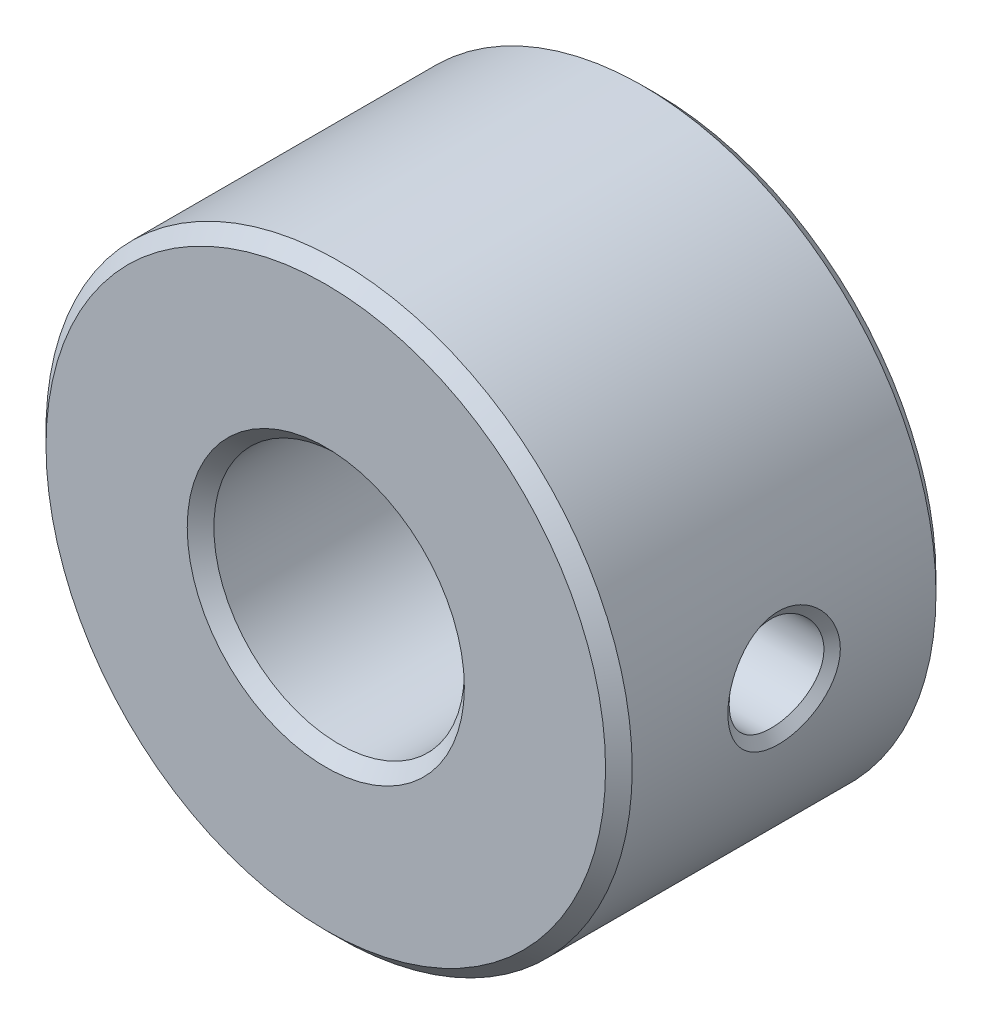
ISO-10303-21;
HEADER;
FILE_DESCRIPTION(('STEP AP214'),'2;1');
FILE_NAME('part.step','',(''),(''),'','','');
FILE_SCHEMA(('AUTOMOTIVE_DESIGN { 1 0 10303 214 1 1 1 1 }'));
ENDSEC;
DATA;
#1=APPLICATION_CONTEXT('core data for automotive mechanical design processes');
#2=APPLICATION_PROTOCOL_DEFINITION('international standard','automotive_design',2000,#1);
#3=PRODUCT_CONTEXT('',#1,'mechanical');
#4=PRODUCT('Part','Part','',(#3));
#5=PRODUCT_RELATED_PRODUCT_CATEGORY('part','',(#4));
#6=PRODUCT_DEFINITION_FORMATION('','',#4);
#7=PRODUCT_DEFINITION_CONTEXT('part definition',#1,'design');
#8=PRODUCT_DEFINITION('design','',#6,#7);
#9=PRODUCT_DEFINITION_SHAPE('','',#8);
#10=(LENGTH_UNIT() NAMED_UNIT(*) SI_UNIT(.MILLI.,.METRE.));
#11=(NAMED_UNIT(*) PLANE_ANGLE_UNIT() SI_UNIT($,.RADIAN.));
#12=(NAMED_UNIT(*) SI_UNIT($,.STERADIAN.) SOLID_ANGLE_UNIT());
#13=UNCERTAINTY_MEASURE_WITH_UNIT(LENGTH_MEASURE(1.E-05),#10,'distance_accuracy_value','');
#14=(GEOMETRIC_REPRESENTATION_CONTEXT(3) GLOBAL_UNCERTAINTY_ASSIGNED_CONTEXT((#13)) GLOBAL_UNIT_ASSIGNED_CONTEXT((#10,
#11,#12)) REPRESENTATION_CONTEXT('',''));
#15=CARTESIAN_POINT('',(0.,0.,0.));
#16=DIRECTION('',(0.,0.,1.));
#17=DIRECTION('',(1.,0.,0.));
#18=AXIS2_PLACEMENT_3D('',#15,#16,#17);
#19=CARTESIAN_POINT('',(0.,0.,-3.1));
#20=DIRECTION('',(0.,0.,1.));
#21=DIRECTION('',(1.,0.,0.));
#22=AXIS2_PLACEMENT_3D('',#19,#20,#21);
#23=CYLINDRICAL_SURFACE('',#22,5.5);
#24=CARTESIAN_POINT('',(5.5,0.,-1.0544551740816));
#25=CARTESIAN_POINT('',(5.500004744347,0.580026043715092,-1.05444676988451));
#26=CARTESIAN_POINT('',(5.39249519245081,1.08234138552855,-0.565479996225667));
#27=CARTESIAN_POINT('',(5.39241001331549,1.08233404109659,0.564563113119124));
#28=CARTESIAN_POINT('',(5.49999234411375,0.581308739379196,1.05443221743905));
#29=CARTESIAN_POINT('',(5.50000765588236,-0.581299487756133,1.05447813070488));
#30=CARTESIAN_POINT('',(5.39241958015795,-1.08225576805672,0.564363377852685));
#31=CARTESIAN_POINT('',(5.39248566019764,-1.08241948623678,-0.565607891176715));
#32=CARTESIAN_POINT('',(5.499995255653,-0.580026043715091,-1.05446357827869));
#33=CARTESIAN_POINT('',(5.5,0.,-1.0544551740816));
#34=B_SPLINE_CURVE_WITH_KNOTS('',3,(#24,#25,#26,#27,#28,#29,#30,#31,#32,#33),.UNSPECIFIED.,.T.,
.F.,(4,2,2,2,4),(-0.0066043131657145,-0.00495192706341636,-0.00329954096111823,
-0.00164715485882009,5.23124347804119E-06),.UNSPECIFIED.);
#35=CARTESIAN_POINT('',(5.5,0.,-1.0544551740816));
#36=VERTEX_POINT('',#35);
#37=EDGE_CURVE('E10',#36,#36,#34,.F.);
#38=ORIENTED_EDGE('',*,*,#37,.T.);
#39=EDGE_LOOP('',(#38));
#40=FACE_BOUND('',#39,.T.);
#41=CARTESIAN_POINT('',(0.,0.,2.84999999999999));
#42=DIRECTION('',(0.,0.,1.));
#43=DIRECTION('',(1.,0.,0.));
#44=AXIS2_PLACEMENT_3D('',#41,#42,#43);
#45=CIRCLE('',#44,5.5);
#46=CARTESIAN_POINT('',(5.5,0.,2.84999999999999));
#47=VERTEX_POINT('',#46);
#48=EDGE_CURVE('E98',#47,#47,#45,.F.);
#49=ORIENTED_EDGE('',*,*,#48,.T.);
#50=EDGE_LOOP('',(#49));
#51=FACE_BOUND('',#50,.T.);
#52=CARTESIAN_POINT('',(0.,0.,-2.85000000000001));
#53=DIRECTION('',(0.,0.,1.));
#54=DIRECTION('',(1.,0.,0.));
#55=AXIS2_PLACEMENT_3D('',#52,#53,#54);
#56=CIRCLE('',#55,5.5);
#57=CARTESIAN_POINT('',(5.5,0.,-2.85000000000001));
#58=VERTEX_POINT('',#57);
#59=EDGE_CURVE('E95',#58,#58,#56,.T.);
#60=ORIENTED_EDGE('',*,*,#59,.T.);
#61=EDGE_LOOP('',(#60));
#62=FACE_BOUND('',#61,.T.);
#63=ADVANCED_FACE('F34',(#40,#51,#62),#23,.T.);
#64=CARTESIAN_POINT('',(0.,0.,-3.1));
#65=DIRECTION('',(0.,0.,1.));
#66=DIRECTION('',(1.,0.,0.));
#67=AXIS2_PLACEMENT_3D('',#64,#65,#66);
#68=PLANE('',#67);
#69=CARTESIAN_POINT('',(0.,0.,-3.1));
#70=DIRECTION('',(0.,0.,1.));
#71=DIRECTION('',(1.,0.,0.));
#72=AXIS2_PLACEMENT_3D('',#69,#70,#71);
#73=CIRCLE('',#72,5.25000000000001);
#74=CARTESIAN_POINT('',(5.25000000000001,0.,-3.1));
#75=VERTEX_POINT('',#74);
#76=EDGE_CURVE('E51',#75,#75,#73,.F.);
#77=ORIENTED_EDGE('',*,*,#76,.T.);
#78=EDGE_LOOP('',(#77));
#79=FACE_BOUND('',#78,.T.);
#80=CARTESIAN_POINT('',(0.,0.,-3.1));
#81=DIRECTION('',(0.,0.,1.));
#82=DIRECTION('',(1.,0.,0.));
#83=AXIS2_PLACEMENT_3D('',#80,#81,#82);
#84=CIRCLE('',#83,2.6);
#85=CARTESIAN_POINT('',(2.6,0.,-3.1));
#86=VERTEX_POINT('',#85);
#87=EDGE_CURVE('E56',#86,#86,#84,.T.);
#88=ORIENTED_EDGE('',*,*,#87,.T.);
#89=EDGE_LOOP('',(#88));
#90=FACE_BOUND('',#89,.T.);
#91=ADVANCED_FACE('F124',(#79,#90),#68,.F.);
#92=CARTESIAN_POINT('',(0.,0.,3.1));
#93=DIRECTION('',(0.,0.,1.));
#94=DIRECTION('',(1.,0.,0.));
#95=AXIS2_PLACEMENT_3D('',#92,#93,#94);
#96=PLANE('',#95);
#97=CARTESIAN_POINT('',(0.,0.,3.1));
#98=DIRECTION('',(0.,0.,1.));
#99=DIRECTION('',(1.,0.,0.));
#100=AXIS2_PLACEMENT_3D('',#97,#98,#99);
#101=CIRCLE('',#100,5.24999999999999);
#102=CARTESIAN_POINT('',(5.24999999999999,0.,3.1));
#103=VERTEX_POINT('',#102);
#104=EDGE_CURVE('E92',#103,#103,#101,.T.);
#105=ORIENTED_EDGE('',*,*,#104,.T.);
#106=EDGE_LOOP('',(#105));
#107=FACE_BOUND('',#106,.T.);
#108=CARTESIAN_POINT('',(0.,0.,3.1));
#109=DIRECTION('',(0.,0.,1.));
#110=DIRECTION('',(1.,0.,0.));
#111=AXIS2_PLACEMENT_3D('',#108,#109,#110);
#112=CIRCLE('',#111,2.59999999999999);
#113=CARTESIAN_POINT('',(2.59999999999999,0.,3.1));
#114=VERTEX_POINT('',#113);
#115=EDGE_CURVE('E89',#114,#114,#112,.F.);
#116=ORIENTED_EDGE('',*,*,#115,.T.);
#117=EDGE_LOOP('',(#116));
#118=FACE_BOUND('',#117,.T.);
#119=ADVANCED_FACE('F129',(#107,#118),#96,.T.);
#120=CARTESIAN_POINT('',(0.,0.,-3.1));
#121=DIRECTION('',(0.,0.,1.));
#122=DIRECTION('',(1.,0.,0.));
#123=AXIS2_PLACEMENT_3D('',#120,#121,#122);
#124=CYLINDRICAL_SURFACE('',#123,2.35);
#125=CARTESIAN_POINT('',(2.35,0.,-0.888999999999999));
#126=CARTESIAN_POINT('',(2.35000140707631,0.048115186925079,-0.889001866284343));
#127=CARTESIAN_POINT('',(2.34850950605383,0.0962177098448817,-0.885081647398307));
#128=CARTESIAN_POINT('',(2.34270733382693,0.190983546485089,-0.869569155087926));
#129=CARTESIAN_POINT('',(2.33839752310871,0.237647094049921,-0.857978135176902));
#130=CARTESIAN_POINT('',(2.32742165295812,0.328154472471897,-0.827593752956557));
#131=CARTESIAN_POINT('',(2.32076018973228,0.372003607811834,-0.808814433885862));
#132=CARTESIAN_POINT('',(2.30574318032279,0.45592547640493,-0.764658613959366));
#133=CARTESIAN_POINT('',(2.29738717154624,0.495997174072754,-0.739280311116151));
#134=CARTESIAN_POINT('',(2.2794398248948,0.572954183020897,-0.681504813032714));
#135=CARTESIAN_POINT('',(2.26981310169239,0.609655171499627,-0.648873197353185));
#136=CARTESIAN_POINT('',(2.25058186695365,0.677212859462352,-0.578015009261017));
#137=CARTESIAN_POINT('',(2.24097736332329,0.70806772388726,-0.539786686732563));
#138=CARTESIAN_POINT('',(2.22246434388203,0.764239837865894,-0.457007170612021));
#139=CARTESIAN_POINT('',(2.21359744468071,0.7892949345214,-0.412267843813389));
#140=CARTESIAN_POINT('',(2.19811523889301,0.831442921290767,-0.318822304459222));
#141=CARTESIAN_POINT('',(2.19149901517726,0.84853905565705,-0.270117717761382));
#142=CARTESIAN_POINT('',(2.18164612219023,0.873553208967144,-0.172247378355854));
#143=CARTESIAN_POINT('',(2.17828031741972,0.881823440129958,-0.123185089673674));
#144=CARTESIAN_POINT('',(2.17493192069827,0.890052178585222,-0.0242625068748073));
#145=CARTESIAN_POINT('',(2.174947899632,0.890014196863178,0.0255974412499916));
#146=CARTESIAN_POINT('',(2.17825007686314,0.881896592517579,0.12145716040321));
#147=CARTESIAN_POINT('',(2.18133648206428,0.874308266703005,0.167506703079702));
#148=CARTESIAN_POINT('',(2.19009929043634,0.852118474357127,0.257622345570875));
#149=CARTESIAN_POINT('',(2.19577609071786,0.837515932520196,0.301688140136281));
#150=CARTESIAN_POINT('',(2.20919860485616,0.801446537300097,0.387577292023376));
#151=CARTESIAN_POINT('',(2.21698181336035,0.779853734667864,0.42934163850231));
#152=CARTESIAN_POINT('',(2.23372797429106,0.730504628502734,0.508795673366254));
#153=CARTESIAN_POINT('',(2.2426913386182,0.702746170684489,0.546483930701603));
#154=CARTESIAN_POINT('',(2.26153660542259,0.639615589040909,0.61943159596374));
#155=CARTESIAN_POINT('',(2.27143937223554,0.603852213440843,0.654347854151304));
#156=CARTESIAN_POINT('',(2.29052063956349,0.526864749477631,0.717790313031165));
#157=CARTESIAN_POINT('',(2.29969902464782,0.485639793600652,0.746315496628208));
#158=CARTESIAN_POINT('',(2.31648562497801,0.398011544653526,0.796553553775788));
#159=CARTESIAN_POINT('',(2.32406639558356,0.351536009233306,0.818150242908417));
#160=CARTESIAN_POINT('',(2.33659954969463,0.25525304126368,0.853104091653567));
#161=CARTESIAN_POINT('',(2.34155312194585,0.205447127140078,0.866464978218503));
#162=CARTESIAN_POINT('',(2.34806379294274,0.106803720431817,0.88390385592193));
#163=CARTESIAN_POINT('',(2.34978972859306,0.0580589698750885,0.888443812242127));
#164=CARTESIAN_POINT('',(2.35017371174371,-0.0395208918615776,0.889459542903284));
#165=CARTESIAN_POINT('',(2.34883245377216,-0.0883559800836499,0.885937142865119));
#166=CARTESIAN_POINT('',(2.34334405086432,-0.182721432554753,0.871277856882935));
#167=CARTESIAN_POINT('',(2.3393090926069,-0.228306275652867,0.860445237049264));
#168=CARTESIAN_POINT('',(2.32895235850414,-0.316978076513538,0.831875351825645));
#169=CARTESIAN_POINT('',(2.32263028544657,-0.360064708787047,0.814137189032529));
#170=CARTESIAN_POINT('',(2.30808985048739,-0.443945642192283,0.771691699404412));
#171=CARTESIAN_POINT('',(2.2998209393578,-0.484634472416177,0.746793789235255));
#172=CARTESIAN_POINT('',(2.28229915052854,-0.561393961141101,0.690950456954975));
#173=CARTESIAN_POINT('',(2.27304590568957,-0.597462885364259,0.660002774753957));
#174=CARTESIAN_POINT('',(2.25389472210002,-0.666187718938294,0.590788536511787));
#175=CARTESIAN_POINT('',(2.24399098311874,-0.69851625618747,0.552197681603637));
#176=CARTESIAN_POINT('',(2.22518056285627,-0.756305276977009,0.469946293881352));
#177=CARTESIAN_POINT('',(2.21627397980038,-0.781765084257673,0.426285262488702));
#178=CARTESIAN_POINT('',(2.20049754418703,-0.825135455645648,0.334736878533443));
#179=CARTESIAN_POINT('',(2.1936376612401,-0.843009240506266,0.286830266935531));
#180=CARTESIAN_POINT('',(2.1829496519933,-0.87031603048621,0.188354455361436));
#181=CARTESIAN_POINT('',(2.17911960480811,-0.879754384077325,0.137786964082003));
#182=CARTESIAN_POINT('',(2.17518303078595,-0.889440006010089,0.0389791697308565));
#183=CARTESIAN_POINT('',(2.17484985703114,-0.890246793174503,-0.00919769622599497));
#184=CARTESIAN_POINT('',(2.17736205525583,-0.884084481019557,-0.104962408624742));
#185=CARTESIAN_POINT('',(2.18020711463272,-0.877116146440682,-0.15255031252995));
#186=CARTESIAN_POINT('',(2.18856506928263,-0.856039915463804,-0.244257231186627));
#187=CARTESIAN_POINT('',(2.19399078321103,-0.842164685389258,-0.288438349406605));
#188=CARTESIAN_POINT('',(2.2068465024456,-0.807875067228952,-0.373870351620757));
#189=CARTESIAN_POINT('',(2.21427701853517,-0.787459012423346,-0.415120485470494));
#190=CARTESIAN_POINT('',(2.23079571551651,-0.739410302866601,-0.49590092479153));
#191=CARTESIAN_POINT('',(2.23995095186575,-0.711452101394908,-0.53522370612719));
#192=CARTESIAN_POINT('',(2.25866014857737,-0.649612983879455,-0.60879807450977));
#193=CARTESIAN_POINT('',(2.26821423604695,-0.61573016862088,-0.643048028870975));
#194=CARTESIAN_POINT('',(2.28728117248565,-0.540758311258718,-0.707442747205063));
#195=CARTESIAN_POINT('',(2.29676234625137,-0.49937382413809,-0.73725447983383));
#196=CARTESIAN_POINT('',(2.31405900429282,-0.411848691517378,-0.78949288857394));
#197=CARTESIAN_POINT('',(2.32187430846855,-0.365707532564603,-0.811918766330602));
#198=CARTESIAN_POINT('',(2.33527961532088,-0.267477134521013,-0.84951666464526));
#199=CARTESIAN_POINT('',(2.34073649042164,-0.215204842707235,-0.864262588368513));
#200=CARTESIAN_POINT('',(2.34809495563215,-0.108615598578685,-0.884000642838147));
#201=CARTESIAN_POINT('',(2.34999841206332,-0.0542997348876734,-0.888997893830376));
#202=CARTESIAN_POINT('',(2.35,0.,-0.888999999999999));
#203=B_SPLINE_CURVE_WITH_KNOTS('',3,(#125,#126,#127,#128,#129,#130,#131,#132,#133,#134,#135,
#136,#137,#138,#139,#140,#141,#142,#143,#144,#145,#146,#147,#148,#149,#150,#151,#152,#153,#154,
#155,#156,#157,#158,#159,#160,#161,#162,#163,#164,#165,#166,#167,#168,#169,#170,#171,#172,#173,
#174,#175,#176,#177,#178,#179,#180,#181,#182,#183,#184,#185,#186,#187,#188,#189,#190,#191,#192,
#193,#194,#195,#196,#197,#198,#199,#200,#201,#202),.UNSPECIFIED.,.T.,.F.,(4,2,2,2,2,2,2,2,2,2,2,
2,2,2,2,2,2,2,2,2,2,2,2,2,2,2,2,2,2,2,2,2,2,2,2,2,2,2,4),(0.,0.144145243594158,
0.288266937707596,0.432108497409597,0.575989377314956,0.72546118440935,0.874979832252769,
1.03031569330107,1.18558818039032,1.33440156217599,1.48315205671698,1.62281739456641,
1.76250415047286,1.9048626459388,2.04727096005129,2.1994329461631,2.35161913062786,
2.5062380285989,2.66078690532585,2.80699705804123,2.95317410655136,3.09361424198755,
3.23407263428154,3.3786847403281,3.52335097455127,3.67656097071541,3.82978604564474,
3.983745741481,4.13760775002091,4.28143055458225,4.42523921435844,4.56450166370071,
4.70379962788388,4.85049184671042,4.99723117620423,5.15210887457551,5.30700330855655,
5.46976195594722,5.63243509540046),.UNSPECIFIED.);
#204=CARTESIAN_POINT('',(2.35,0.,-0.888999999999999));
#205=VERTEX_POINT('',#204);
#206=EDGE_CURVE('E84',#205,#205,#203,.T.);
#207=ORIENTED_EDGE('',*,*,#206,.T.);
#208=EDGE_LOOP('',(#207));
#209=FACE_BOUND('',#208,.T.);
#210=CARTESIAN_POINT('',(0.,0.,2.85000000000001));
#211=DIRECTION('',(0.,0.,1.));
#212=DIRECTION('',(1.,0.,0.));
#213=AXIS2_PLACEMENT_3D('',#210,#211,#212);
#214=CIRCLE('',#213,2.35);
#215=CARTESIAN_POINT('',(2.35,0.,2.85000000000001));
#216=VERTEX_POINT('',#215);
#217=EDGE_CURVE('E61',#216,#216,#214,.T.);
#218=ORIENTED_EDGE('',*,*,#217,.T.);
#219=EDGE_LOOP('',(#218));
#220=FACE_BOUND('',#219,.T.);
#221=CARTESIAN_POINT('',(0.,0.,-2.84999999999999));
#222=DIRECTION('',(0.,0.,1.));
#223=DIRECTION('',(1.,0.,0.));
#224=AXIS2_PLACEMENT_3D('',#221,#222,#223);
#225=CIRCLE('',#224,2.35);
#226=CARTESIAN_POINT('',(2.35,0.,-2.84999999999999));
#227=VERTEX_POINT('',#226);
#228=EDGE_CURVE('E101',#227,#227,#225,.F.);
#229=ORIENTED_EDGE('',*,*,#228,.T.);
#230=EDGE_LOOP('',(#229));
#231=FACE_BOUND('',#230,.T.);
#232=ADVANCED_FACE('F79',(#209,#220,#231),#124,.F.);
#233=CARTESIAN_POINT('',(0.,0.,3.1));
#234=DIRECTION('',(0.,0.,-1.));
#235=DIRECTION('',(-1.,0.,0.));
#236=AXIS2_PLACEMENT_3D('',#233,#234,#235);
#237=CONICAL_SURFACE('',#236,5.24999999999999,0.785398163397447);
#238=ORIENTED_EDGE('',*,*,#48,.F.);
#239=EDGE_LOOP('',(#238));
#240=FACE_BOUND('',#239,.T.);
#241=ORIENTED_EDGE('',*,*,#104,.F.);
#242=EDGE_LOOP('',(#241));
#243=FACE_BOUND('',#242,.T.);
#244=ADVANCED_FACE('F111',(#240,#243),#237,.T.);
#245=CARTESIAN_POINT('',(0.,0.,2.85000000000001));
#246=DIRECTION('',(0.,0.,1.));
#247=DIRECTION('',(1.,0.,0.));
#248=AXIS2_PLACEMENT_3D('',#245,#246,#247);
#249=CONICAL_SURFACE('',#248,2.35,0.785398163397448);
#250=ORIENTED_EDGE('',*,*,#115,.F.);
#251=EDGE_LOOP('',(#250));
#252=FACE_BOUND('',#251,.T.);
#253=ORIENTED_EDGE('',*,*,#217,.F.);
#254=EDGE_LOOP('',(#253));
#255=FACE_BOUND('',#254,.T.);
#256=ADVANCED_FACE('F108',(#252,#255),#249,.F.);
#257=CARTESIAN_POINT('',(0.,0.,-2.85000000000001));
#258=DIRECTION('',(0.,0.,1.));
#259=DIRECTION('',(1.,0.,0.));
#260=AXIS2_PLACEMENT_3D('',#257,#258,#259);
#261=CONICAL_SURFACE('',#260,5.5,0.785398163397445);
#262=ORIENTED_EDGE('',*,*,#76,.F.);
#263=EDGE_LOOP('',(#262));
#264=FACE_BOUND('',#263,.T.);
#265=ORIENTED_EDGE('',*,*,#59,.F.);
#266=EDGE_LOOP('',(#265));
#267=FACE_BOUND('',#266,.T.);
#268=ADVANCED_FACE('F110',(#264,#267),#261,.T.);
#269=CARTESIAN_POINT('',(0.,0.,-3.1));
#270=DIRECTION('',(0.,0.,-1.));
#271=DIRECTION('',(-1.,0.,0.));
#272=AXIS2_PLACEMENT_3D('',#269,#270,#271);
#273=CONICAL_SURFACE('',#272,2.6,0.785398163397446);
#274=ORIENTED_EDGE('',*,*,#228,.F.);
#275=EDGE_LOOP('',(#274));
#276=FACE_BOUND('',#275,.T.);
#277=ORIENTED_EDGE('',*,*,#87,.F.);
#278=EDGE_LOOP('',(#277));
#279=FACE_BOUND('',#278,.T.);
#280=ADVANCED_FACE('F78',(#276,#279),#273,.F.);
#281=CARTESIAN_POINT('',(5.5,0.,0.));
#282=DIRECTION('',(1.,0.,0.));
#283=DIRECTION('',(0.,0.,-1.));
#284=AXIS2_PLACEMENT_3D('',#281,#282,#283);
#285=CYLINDRICAL_SURFACE('',#284,0.888999999999998);
#286=CARTESIAN_POINT('',(5.35831177090091,0.,-0.888999999999998));
#287=CARTESIAN_POINT('',(5.35831190454961,-0.0148303368773454,-0.889001122594029));
#288=CARTESIAN_POINT('',(5.35821000208172,-0.0296602449487385,-0.888601095422739));
#289=CARTESIAN_POINT('',(5.35781313056451,-0.0591737232770636,-0.887011904584699));
#290=CARTESIAN_POINT('',(5.35751948290577,-0.0738576018014636,-0.885828141176691));
#291=CARTESIAN_POINT('',(5.35675195497271,-0.10305723083344,-0.882692976828264));
#292=CARTESIAN_POINT('',(5.35627906575487,-0.117573461493737,-0.880745794956692));
#293=CARTESIAN_POINT('',(5.3551662392455,-0.146416474950188,-0.876106467732402));
#294=CARTESIAN_POINT('',(5.35452701914742,-0.160743800196549,-0.873417517847655));
#295=CARTESIAN_POINT('',(5.35309454661383,-0.189187694444922,-0.867316800242118));
#296=CARTESIAN_POINT('',(5.3523017932197,-0.203304790848007,-0.863907371165085));
#297=CARTESIAN_POINT('',(5.35057524417366,-0.231307013386006,-0.856387766842206));
#298=CARTESIAN_POINT('',(5.34964177897248,-0.245192600517681,-0.852279230557509));
#299=CARTESIAN_POINT('',(5.34764674003821,-0.272710628364245,-0.843383299459958));
#300=CARTESIAN_POINT('',(5.34658537136636,-0.286343434896508,-0.83859698918654));
#301=CARTESIAN_POINT('',(5.34434741955788,-0.313334749295235,-0.828367259645517));
#302=CARTESIAN_POINT('',(5.34317095234548,-0.326693517087186,-0.822924500275505));
#303=CARTESIAN_POINT('',(5.34071566239075,-0.353115606160227,-0.811403492023596));
#304=CARTESIAN_POINT('',(5.33943689579563,-0.366179084529708,-0.805325591186736));
#305=CARTESIAN_POINT('',(5.33678983854157,-0.391989438944354,-0.792555809409549));
#306=CARTESIAN_POINT('',(5.33542156708004,-0.404736382077489,-0.78586406000713));
#307=CARTESIAN_POINT('',(5.33260831039065,-0.429892493126496,-0.771887997582564));
#308=CARTESIAN_POINT('',(5.33116332430376,-0.442301657257677,-0.764603677924525));
#309=CARTESIAN_POINT('',(5.32820943335275,-0.466761014847309,-0.749463815748874));
#310=CARTESIAN_POINT('',(5.32670051927188,-0.478811156114662,-0.741608190746328));
#311=CARTESIAN_POINT('',(5.32363155702158,-0.502531247288997,-0.725346998706824));
#312=CARTESIAN_POINT('',(5.32207149859278,-0.51420111996777,-0.716941320990351));
#313=CARTESIAN_POINT('',(5.31891302622216,-0.537139427728482,-0.699601258791105));
#314=CARTESIAN_POINT('',(5.31731460474357,-0.548407782830248,-0.690666769904733));
#315=CARTESIAN_POINT('',(5.31409218207409,-0.570521785227812,-0.672290287885338));
#316=CARTESIAN_POINT('',(5.3124681771114,-0.581367369359555,-0.662848219414979));
#317=CARTESIAN_POINT('',(5.3092073630118,-0.602614538768943,-0.643477759283331));
#318=CARTESIAN_POINT('',(5.30757055299372,-0.613016093167807,-0.633549333902509));
#319=CARTESIAN_POINT('',(5.30429690576963,-0.633353895681595,-0.613227329389931));
#320=CARTESIAN_POINT('',(5.30266006856531,-0.643290155341479,-0.602833761811878));
#321=CARTESIAN_POINT('',(5.29939914633791,-0.662676050216241,-0.581602639259675));
#322=CARTESIAN_POINT('',(5.29777505982468,-0.672125743035067,-0.570765137116331));
#323=CARTESIAN_POINT('',(5.29455242090566,-0.69051718213796,-0.548667316023314));
#324=CARTESIAN_POINT('',(5.29295386353724,-0.699459028028562,-0.53740708071105));
#325=CARTESIAN_POINT('',(5.2897950668081,-0.716813455242294,-0.514484974283934));
#326=CARTESIAN_POINT('',(5.2882348181934,-0.725226165167441,-0.502823201833816));
#327=CARTESIAN_POINT('',(5.28516542349609,-0.741501015726046,-0.479119217594501));
#328=CARTESIAN_POINT('',(5.2836562649966,-0.749363290639868,-0.467077099639348));
#329=CARTESIAN_POINT('',(5.28070183354056,-0.764515990381649,-0.442633640152694));
#330=CARTESIAN_POINT('',(5.27925654888922,-0.77180652008248,-0.430232365074027));
#331=CARTESIAN_POINT('',(5.27644264367697,-0.785794484632179,-0.40509182886763));
#332=CARTESIAN_POINT('',(5.27507401961533,-0.792491946571872,-0.392352583212687));
#333=CARTESIAN_POINT('',(5.27242620588111,-0.80527258045941,-0.366557365961457));
#334=CARTESIAN_POINT('',(5.27114703279792,-0.81135563855375,-0.353501336216669));
#335=CARTESIAN_POINT('',(5.26869087845664,-0.822886334400759,-0.327093832270869));
#336=CARTESIAN_POINT('',(5.26751395101146,-0.828333638061211,-0.313742207078171));
#337=CARTESIAN_POINT('',(5.2652750270716,-0.83857177562496,-0.286764811372486));
#338=CARTESIAN_POINT('',(5.26421314472368,-0.843361958770491,-0.27313878420769));
#339=CARTESIAN_POINT('',(5.262217025741,-0.852264905041646,-0.245633894680498));
#340=CARTESIAN_POINT('',(5.26128299326904,-0.856376586775272,-0.231754667124065));
#341=CARTESIAN_POINT('',(5.25955525741301,-0.863901693197843,-0.20376468731606));
#342=CARTESIAN_POINT('',(5.25876188481881,-0.867313474812652,-0.189653472400806));
#343=CARTESIAN_POINT('',(5.25732811496913,-0.873418086989234,-0.161220815437901));
#344=CARTESIAN_POINT('',(5.2566882186864,-0.876108566375156,-0.146898842644176));
#345=CARTESIAN_POINT('',(5.25557399902973,-0.880749989429827,-0.118065931801708));
#346=CARTESIAN_POINT('',(5.2551003968414,-0.882697714981861,-0.10355444702269));
#347=CARTESIAN_POINT('',(5.25433132547364,-0.885833348446652,-0.0743637302769782));
#348=CARTESIAN_POINT('',(5.25403685327783,-0.887017005977369,-0.0596840145472819));
#349=CARTESIAN_POINT('',(5.25363849354749,-0.888603845306748,-0.0301779267542147));
#350=CARTESIAN_POINT('',(5.25353593778698,-0.889001574334195,-0.015351242447743));
#351=CARTESIAN_POINT('',(5.25353400713321,-0.888998115951286,0.014303087906259));
#352=CARTESIAN_POINT('',(5.25363464706078,-0.888596870264786,0.0291307339450555));
#353=CARTESIAN_POINT('',(5.25402947776997,-0.887006161921521,0.0586407055200229));
#354=CARTESIAN_POINT('',(5.25432235964236,-0.885822029279329,0.073323336986674));
#355=CARTESIAN_POINT('',(5.25508845830273,-0.882687508098935,0.102521709355379));
#356=CARTESIAN_POINT('',(5.25556069608906,-0.880741277660689,0.11703792316432));
#357=CARTESIAN_POINT('',(5.25667240916844,-0.87610489399279,0.145881993060078));
#358=CARTESIAN_POINT('',(5.25731117628767,-0.873417888228795,0.160210383189186));
#359=CARTESIAN_POINT('',(5.25874289462728,-0.867321973342814,0.18865744554834));
#360=CARTESIAN_POINT('',(5.25953535377036,-0.863915365154726,0.202776636261017));
#361=CARTESIAN_POINT('',(5.26126146108786,-0.856402135948246,0.230784007129573));
#362=CARTESIAN_POINT('',(5.26219478398294,-0.852297124956055,0.244672639727525));
#363=CARTESIAN_POINT('',(5.26418967088584,-0.843408813520283,0.272197645736127));
#364=CARTESIAN_POINT('',(5.26525103361467,-0.838626575673299,0.285834377200523));
#365=CARTESIAN_POINT('',(5.26748909389379,-0.828405393542211,0.312834354009801));
#366=CARTESIAN_POINT('',(5.26866567825471,-0.822967092555345,0.326197852470148));
#367=CARTESIAN_POINT('',(5.27112130967385,-0.811455239830382,0.35263014114313));
#368=CARTESIAN_POINT('',(5.27240030257246,-0.805382023359947,0.365699082509045));
#369=CARTESIAN_POINT('',(5.2750479062933,-0.792621686481499,0.391521026907244));
#370=CARTESIAN_POINT('',(5.27641649940204,-0.785934687310756,0.404274091703705));
#371=CARTESIAN_POINT('',(5.27923047966624,-0.77196804030137,0.429443036150096));
#372=CARTESIAN_POINT('',(5.28067586884584,-0.764688376838998,0.441858906899452));
#373=CARTESIAN_POINT('',(5.2836306325286,-0.749557581887162,0.466332194314998));
#374=CARTESIAN_POINT('',(5.28514001722089,-0.74170635925231,0.478389553376366));
#375=CARTESIAN_POINT('',(5.28820997339546,-0.725453567602771,0.502124523792197));
#376=CARTESIAN_POINT('',(5.28977055598606,-0.717051878754842,0.513802051626134));
#377=CARTESIAN_POINT('',(5.29293011548655,-0.699719231541851,0.536756041025236));
#378=CARTESIAN_POINT('',(5.29452910067384,-0.690788158451694,0.548032414801099));
#379=CARTESIAN_POINT('',(5.29775267567389,-0.672417787501723,0.570162754214204));
#380=CARTESIAN_POINT('',(5.29937726985447,-0.662978402267329,0.581016646674497));
#381=CARTESIAN_POINT('',(5.30263927346285,-0.643612430824843,0.602280661458207));
#382=CARTESIAN_POINT('',(5.30427668413756,-0.633685796705007,0.61269073995207));
#383=CARTESIAN_POINT('',(5.30755153000923,-0.613366340082161,0.633045749179575));
#384=CARTESIAN_POINT('',(5.30918896520626,-0.602973512441544,0.642990674784611));
#385=CARTESIAN_POINT('',(5.31245106716374,-0.581742678603899,0.662393990687096));
#386=CARTESIAN_POINT('',(5.31407573487083,-0.570904705790172,0.67185241734975));
#387=CARTESIAN_POINT('',(5.31729950652874,-0.548804595907908,0.690261344756383));
#388=CARTESIAN_POINT('',(5.31889861412458,-0.537542520101645,0.69921191839577));
#389=CARTESIAN_POINT('',(5.3220584685097,-0.514615229108655,0.716583754131963));
#390=CARTESIAN_POINT('',(5.32361922218479,-0.502950087204034,0.725005111669775));
#391=CARTESIAN_POINT('',(5.32668957134479,-0.479237704418978,0.741297143887216));
#392=CARTESIAN_POINT('',(5.32819917550442,-0.467190529007452,0.749167912187816));
#393=CARTESIAN_POINT('',(5.33115443010048,-0.442735138880193,0.764337419615416));
#394=CARTESIAN_POINT('',(5.33260008674741,-0.430326959419675,0.771636214345239));
#395=CARTESIAN_POINT('',(5.33541465562971,-0.405170642473836,0.785640465470189));
#396=CARTESIAN_POINT('',(5.33678356373146,-0.392422486732066,0.792345889917988));
#397=CARTESIAN_POINT('',(5.33943185350119,-0.366607320775698,0.805142142122901));
#398=CARTESIAN_POINT('',(5.34071120835654,-0.353540216632493,0.811232786051141));
#399=CARTESIAN_POINT('',(5.3431676229265,-0.327108278311911,0.822778284777095));
#400=CARTESIAN_POINT('',(5.34434461556068,-0.313743256001031,0.82823272344088));
#401=CARTESIAN_POINT('',(5.34658355572833,-0.286736622738289,0.838484701402748));
#402=CARTESIAN_POINT('',(5.34764537235213,-0.273094717551248,0.843281494818167));
#403=CARTESIAN_POINT('',(5.34964123543252,-0.245555469968826,0.852197171589929));
#404=CARTESIAN_POINT('',(5.35057505704958,-0.231657725515268,0.856314864533735));
#405=CARTESIAN_POINT('',(5.35230223653309,-0.203627950093233,0.863851445858929));
#406=CARTESIAN_POINT('',(5.35309523866795,-0.189495421705978,0.867268567759644));
#407=CARTESIAN_POINT('',(5.35452812421911,-0.161017214568872,0.873383247649316));
#408=CARTESIAN_POINT('',(5.35516747721886,-0.146670974003179,0.876078316592731));
#409=CARTESIAN_POINT('',(5.35628045404897,-0.11778644216054,0.880728271445121));
#410=CARTESIAN_POINT('',(5.35675332264574,-0.103247578455327,0.882679787533411));
#411=CARTESIAN_POINT('',(5.35752077412229,-0.0739988516557733,0.885822203356805));
#412=CARTESIAN_POINT('',(5.35781432156342,-0.0592884861288995,0.887008687779139));
#413=CARTESIAN_POINT('',(5.35821062075602,-0.0297176888898553,0.88860066669085));
#414=CARTESIAN_POINT('',(5.35831199782893,-0.0148569348461535,0.889000534932822));
#415=CARTESIAN_POINT('',(5.35831154396784,0.0148646166354237,0.888999465047955));
#416=CARTESIAN_POINT('',(5.35820971190186,0.0297254140730797,0.888598522460195));
#417=CARTESIAN_POINT('',(5.35781255396556,0.0592964007654972,0.887004983896161));
#418=CARTESIAN_POINT('',(5.35751860084809,0.0740069121079275,0.885818003566247));
#419=CARTESIAN_POINT('',(5.35675037496354,0.103256020524983,0.882674991871964));
#420=CARTESIAN_POINT('',(5.35627713664381,0.117795119495568,0.88072337019977));
#421=CARTESIAN_POINT('',(5.35516345873241,0.146680201819977,0.876073609002269));
#422=CARTESIAN_POINT('',(5.35452377407522,0.161026757190725,0.873378836891048));
#423=CARTESIAN_POINT('',(5.35309026101311,0.189505662588135,0.86726511144889));
#424=CARTESIAN_POINT('',(5.35229696328856,0.203638574475321,0.863848647723223));
#425=CARTESIAN_POINT('',(5.35056922712084,0.23166917416672,0.856313714231971));
#426=CARTESIAN_POINT('',(5.34963514508301,0.245567360106184,0.852197013873943));
#427=CARTESIAN_POINT('',(5.34763879420442,0.273107536298343,0.843283621237289));
#428=CARTESIAN_POINT('',(5.34657675114952,0.286749930115494,0.838488124147681));
#429=CARTESIAN_POINT('',(5.34433738992465,0.313757574567852,0.82823900681769));
#430=CARTESIAN_POINT('',(5.34316020376076,0.327123121769109,0.822786138591669));
#431=CARTESIAN_POINT('',(5.3407034327949,0.353556132074987,0.811244017954693));
#432=CARTESIAN_POINT('',(5.33942391621664,0.366623786437917,0.80515518872399));
#433=CARTESIAN_POINT('',(5.3367753326261,0.392440063364679,0.792362772860912));
#434=CARTESIAN_POINT('',(5.33540629353348,0.405188783696649,0.785659377635311));
#435=CARTESIAN_POINT('',(5.33259149133129,0.430346228775058,0.771659361982792));
#436=CARTESIAN_POINT('',(5.33114573336275,0.442754976219199,0.764362781288546));
#437=CARTESIAN_POINT('',(5.32819030387959,0.467211489812818,0.749197849353714));
#438=CARTESIAN_POINT('',(5.32668062701743,0.479259225615012,0.741329450234418));
#439=CARTESIAN_POINT('',(5.32361015934141,0.502972705372334,0.725042274445367));
#440=CARTESIAN_POINT('',(5.32204936054339,0.514638389084582,0.716623411598355));
#441=CARTESIAN_POINT('',(5.31888944195678,0.537566728731887,0.699256654157786));
#442=CARTESIAN_POINT('',(5.3172903157876,0.548829316772206,0.690308671109654));
#443=CARTESIAN_POINT('',(5.31406653219062,0.570930405172795,0.671904984810895));
#444=CARTESIAN_POINT('',(5.31244187143818,0.581768849657132,0.662449215051982));
#445=CARTESIAN_POINT('',(5.30917980775576,0.603000570065132,0.643051244024093));
#446=CARTESIAN_POINT('',(5.30754240402731,0.61339381782307,0.633109012063694));
#447=CARTESIAN_POINT('',(5.30426764459995,0.633714047261396,0.612759392438744));
#448=CARTESIAN_POINT('',(5.30263028890078,0.643641038953529,0.602352014771468));
#449=CARTESIAN_POINT('',(5.29936841786433,0.663007647652894,0.581093375284486));
#450=CARTESIAN_POINT('',(5.29774390116615,0.67244731691809,0.570242161284119));
#451=CARTESIAN_POINT('',(5.29452050282726,0.690818167763262,0.548117123832494));
#452=CARTESIAN_POINT('',(5.29292161663611,0.699749440338185,0.536843376610841));
#453=CARTESIAN_POINT('',(5.28976227585107,0.71708238827939,0.513894556813544));
#454=CARTESIAN_POINT('',(5.28820181278449,0.725484181050002,0.502219574099498));
#455=CARTESIAN_POINT('',(5.28513211534841,0.74173707245034,0.478489581908339));
#456=CARTESIAN_POINT('',(5.28362286972969,0.749588292415265,0.466434657017039));
#457=CARTESIAN_POINT('',(5.28066840278133,0.764718964322119,0.441966097441898));
#458=CARTESIAN_POINT('',(5.27922317125441,0.771998507474603,0.429552520414795));
#459=CARTESIAN_POINT('',(5.27640952369768,0.785964786815521,0.404387994432484));
#460=CARTESIAN_POINT('',(5.27504110585812,0.792651536972502,0.391637053436104));
#461=CARTESIAN_POINT('',(5.27239386879951,0.805411239718654,0.365819159154672));
#462=CARTESIAN_POINT('',(5.27111506783151,0.811484067389442,0.352752142223441));
#463=CARTESIAN_POINT('',(5.26865983501505,0.822994997674464,0.326323476377201));
#464=CARTESIAN_POINT('',(5.26748345829694,0.828432758992074,0.312961673582713));
#465=CARTESIAN_POINT('',(5.26524582655142,0.838652708498497,0.285964833402984));
#466=CARTESIAN_POINT('',(5.26418468623413,0.843434244685306,0.272329539480037));
#467=CARTESIAN_POINT('',(5.26219025578421,0.852320991526686,0.244807125041558));
#468=CARTESIAN_POINT('',(5.26125716912065,0.856425127886052,0.230919642562913));
#469=CARTESIAN_POINT('',(5.25953154418096,0.863936438392459,0.202914259388145));
#470=CARTESIAN_POINT('',(5.25873933415931,0.867341987533027,0.188795902129183));
#471=CARTESIAN_POINT('',(5.25730812206374,0.87343560882255,0.160350164844428));
#472=CARTESIAN_POINT('',(5.25666961593109,0.876121361552089,0.146022262347873));
#473=CARTESIAN_POINT('',(5.25555843112927,0.880755050976836,0.11717879614951));
#474=CARTESIAN_POINT('',(5.2550864654706,0.882699818052028,0.102662694955918));
#475=CARTESIAN_POINT('',(5.25432091440886,0.885831237350208,0.0734641464684186));
#476=CARTESIAN_POINT('',(5.25402831386063,0.887013705756455,0.0587812238126521));
#477=CARTESIAN_POINT('',(5.25363405061826,0.888600827272119,0.0292702369060112));
#478=CARTESIAN_POINT('',(5.25353370373961,0.889000120641921,0.0144418657301972));
#479=CARTESIAN_POINT('',(5.25353620749462,0.888999711327266,-0.0152141913613528));
#480=CARTESIAN_POINT('',(5.25363904868946,0.888600045757279,-0.0300418772769237));
#481=CARTESIAN_POINT('',(5.25403795495854,0.887009647550718,-0.0595500841435567));
#482=CARTESIAN_POINT('',(5.25433269108549,0.885824354679294,-0.0742309172676516));
#483=CARTESIAN_POINT('',(5.25510227027858,0.882685673307613,-0.10342397557009));
#484=CARTESIAN_POINT('',(5.25557611850962,0.88073652529746,-0.117936683806132));
#485=CARTESIAN_POINT('',(5.25669080991897,0.876092486120536,-0.146772140508724));
#486=CARTESIAN_POINT('',(5.25733093346933,0.873400805543895,-0.161095434689645));
#487=CARTESIAN_POINT('',(5.25876513836155,0.867294000153554,-0.189530824779312));
#488=CARTESIAN_POINT('',(5.25955871976759,0.86388122127958,-0.20364345039318));
#489=CARTESIAN_POINT('',(5.2612868541923,0.856354316970018,-0.231636333196425));
#490=CARTESIAN_POINT('',(5.26222107702307,0.852241831387128,-0.245517052207358));
#491=CARTESIAN_POINT('',(5.26421755810303,0.84333745995511,-0.273024997242716));
#492=CARTESIAN_POINT('',(5.2652796124429,0.838546654025033,-0.286652587983357));
#493=CARTESIAN_POINT('',(5.2675188620703,0.828307440105372,-0.313633174296443));
#494=CARTESIAN_POINT('',(5.26869594319977,0.822859682873502,-0.326986426518368));
#495=CARTESIAN_POINT('',(5.27115238686004,0.811328235921542,-0.353397238734231));
#496=CARTESIAN_POINT('',(5.27243169537911,0.805244881502889,-0.366454950257716));
#497=CARTESIAN_POINT('',(5.27507976210507,0.792463798127343,-0.392253575981604));
#498=CARTESIAN_POINT('',(5.27644850340488,0.785766185198739,-0.404994549435615));
#499=CARTESIAN_POINT('',(5.27926262531737,0.771778049184914,-0.430138576842257));
#500=CARTESIAN_POINT('',(5.28070800905327,0.764487501930823,-0.442541616992696));
#501=CARTESIAN_POINT('',(5.28366262094996,0.749334885163924,-0.466988632922347));
#502=CARTESIAN_POINT('',(5.28517186041758,0.741472714256108,-0.479032544462181));
#503=CARTESIAN_POINT('',(5.28824139932402,0.725198177541816,-0.502740132897349));
#504=CARTESIAN_POINT('',(5.28980171082137,0.716785681324038,-0.514403718678006));
#505=CARTESIAN_POINT('',(5.29296061555298,0.699431775265399,-0.537329459562338));
#506=CARTESIAN_POINT('',(5.29455921774392,0.690490240942402,-0.54859151918026));
#507=CARTESIAN_POINT('',(5.29778192848085,0.672099506755947,-0.570692987501223));
#508=CARTESIAN_POINT('',(5.29940604177689,0.66265021153744,-0.581532316153188));
#509=CARTESIAN_POINT('',(5.30266699965743,0.643265181797727,-0.602767081215761));
#510=CARTESIAN_POINT('',(5.30430384562089,0.633329393954031,-0.613162468732942));
#511=CARTESIAN_POINT('',(5.30757749235116,0.612992593255718,-0.633488093552965));
#512=CARTESIAN_POINT('',(5.30921429311684,0.60259157307994,-0.643418323530786));
#513=CARTESIAN_POINT('',(5.31247507059177,0.581345518630901,-0.662792364284471));
#514=CARTESIAN_POINT('',(5.31409904829901,0.570500519325667,-0.672236213236173));
#515=CARTESIAN_POINT('',(5.31732139822749,0.548387721498915,-0.690616218711893));
#516=CARTESIAN_POINT('',(5.31891977445251,0.537119990027268,-0.699552455188156));
#517=CARTESIAN_POINT('',(5.32207813797877,0.514182952913546,-0.71689596619873));
#518=CARTESIAN_POINT('',(5.32363813315721,0.502513730871192,-0.72530334983369));
#519=CARTESIAN_POINT('',(5.32670695047109,0.478794952885441,-0.741567898559742));
#520=CARTESIAN_POINT('',(5.32821578330229,0.466745477465655,-0.749425179023044));
#521=CARTESIAN_POINT('',(5.33116949323427,0.442287452071553,-0.764568288278431));
#522=CARTESIAN_POINT('',(5.33261438006551,0.429878957206637,-0.771854204144454));
#523=CARTESIAN_POINT('',(5.3354274196606,0.404724173826368,-0.785833386555812));
#524=CARTESIAN_POINT('',(5.33679557384932,0.391977891590009,-0.792526664107437));
#525=CARTESIAN_POINT('',(5.33944237793879,0.366168836786259,-0.805299421286521));
#526=CARTESIAN_POINT('',(5.34072100922783,0.353105999162743,-0.811378773395095));
#527=CARTESIAN_POINT('',(5.34317600994999,0.326685158117012,-0.822902594964586));
#528=CARTESIAN_POINT('',(5.3443523238018,0.313326999149453,-0.82834671989616));
#529=CARTESIAN_POINT('',(5.34658995030943,0.286336857677393,-0.83857908316325));
#530=CARTESIAN_POINT('',(5.34765114754006,0.272704616292276,-0.843366664442541));
#531=CARTESIAN_POINT('',(5.34964582510163,0.24518766276765,-0.852265032157177));
#532=CARTESIAN_POINT('',(5.35057910074963,0.231302585370809,-0.856374736032359));
#533=CARTESIAN_POINT('',(5.35230525234684,0.203301315062803,-0.8638965623453));
#534=CARTESIAN_POINT('',(5.3530977980434,0.189184661272317,-0.867307046739538));
#535=CARTESIAN_POINT('',(5.35452983703929,0.160741573698802,-0.873409754159137));
#536=CARTESIAN_POINT('',(5.35516883125212,0.146414612266424,-0.876099638193492));
#537=CARTESIAN_POINT('',(5.35628118814626,0.117572236485234,-0.880740705601978));
#538=CARTESIAN_POINT('',(5.3567538332828,0.103056279188009,-0.882688691701482));
#539=CARTESIAN_POINT('',(5.35752085544155,0.0738570954443859,-0.885825328791475));
#540=CARTESIAN_POINT('',(5.35781424068981,0.0591733882533506,-0.887009757271321));
#541=CARTESIAN_POINT('',(5.35821057054763,0.0296601393654516,-0.88860013697436));
#542=CARTESIAN_POINT('',(5.35831219263806,0.0148302889102646,-0.889000682747209));
#543=CARTESIAN_POINT('',(5.35831177090091,0.,-0.888999999999998));
#544=B_SPLINE_CURVE_WITH_KNOTS('',3,(#286,#287,#288,#289,#290,#291,#292,#293,#294,#295,#296,
#297,#298,#299,#300,#301,#302,#303,#304,#305,#306,#307,#308,#309,#310,#311,#312,#313,#314,#315,
#316,#317,#318,#319,#320,#321,#322,#323,#324,#325,#326,#327,#328,#329,#330,#331,#332,#333,#334,
#335,#336,#337,#338,#339,#340,#341,#342,#343,#344,#345,#346,#347,#348,#349,#350,#351,#352,#353,
#354,#355,#356,#357,#358,#359,#360,#361,#362,#363,#364,#365,#366,#367,#368,#369,#370,#371,#372,
#373,#374,#375,#376,#377,#378,#379,#380,#381,#382,#383,#384,#385,#386,#387,#388,#389,#390,#391,
#392,#393,#394,#395,#396,#397,#398,#399,#400,#401,#402,#403,#404,#405,#406,#407,#408,#409,#410,
#411,#412,#413,#414,#415,#416,#417,#418,#419,#420,#421,#422,#423,#424,#425,#426,#427,#428,#429,
#430,#431,#432,#433,#434,#435,#436,#437,#438,#439,#440,#441,#442,#443,#444,#445,#446,#447,#448,
#449,#450,#451,#452,#453,#454,#455,#456,#457,#458,#459,#460,#461,#462,#463,#464,#465,#466,#467,
#468,#469,#470,#471,#472,#473,#474,#475,#476,#477,#478,#479,#480,#481,#482,#483,#484,#485,#486,
#487,#488,#489,#490,#491,#492,#493,#494,#495,#496,#497,#498,#499,#500,#501,#502,#503,#504,#505,
#506,#507,#508,#509,#510,#511,#512,#513,#514,#515,#516,#517,#518,#519,#520,#521,#522,#523,#524,
#525,#526,#527,#528,#529,#530,#531,#532,#533,#534,#535,#536,#537,#538,#539,#540,#541,#542,#543),
.UNSPECIFIED.,.F.,.F.,(4,2,2,2,2,2,2,2,2,2,2,2,2,2,2,2,2,2,2,2,2,2,2,2,2,2,2,2,2,2,2,2,2,2,2,2,
2,2,2,2,2,2,2,2,2,2,2,2,2,2,2,2,2,2,2,2,2,2,2,2,2,2,2,2,2,2,2,2,2,2,2,2,2,2,2,2,2,2,2,2,2,2,2,2,
2,2,2,2,2,2,2,2,2,2,2,2,2,2,2,2,2,2,2,2,2,2,2,2,2,2,2,2,2,2,2,2,2,2,2,2,2,2,2,2,2,2,2,2,4),(0.,
0.0444845787419373,0.0886657871221271,0.132606191866078,0.176360184436932,0.219974277052544,
0.263487496668102,0.306931859331802,0.350332907816813,0.393710296869566,0.437078412459951,
0.48044701377457,0.52382188911644,0.567205519183446,0.610597743271607,0.65399642571516,
0.697398121295968,0.740798739416263,0.78419420752982,0.827581134671118,0.870957475912642,
0.914323198217029,0.957680947429679,1.00103671507492,1.04440050217593,1.08778697552985,
1.13121610977365,1.17471380624812,1.21831247723213,1.26205158176067,1.30597809720615,
1.35014690939631,1.39462110359848,1.43909854180756,1.48327624666206,1.52721619781439,
1.5709722566841,1.61459046759275,1.6581094552594,1.70156090122964,1.74497008235709,
1.78835645591471,1.83173427795692,1.87511324388936,1.91849914259545,1.96189451774061,
2.00529933191066,2.04871163096777,2.09212820739127,2.13554526239743,2.17895906730096,
2.2223666248956,2.26576633159334,2.30915864067279,2.3525467262431,2.39593714642836,
2.43934050282224,2.48277209147053,2.52625253855345,2.569808411639,2.61347279499239,
2.65728581514297,2.70129510097626,2.74555616133699,2.79013266282557,2.83470941262845,
2.87897108219665,2.92298116519376,2.96679501371153,3.01046011716298,3.05401648053319,
3.09749708472879,3.14092841208222,3.18433102135213,3.22772015849221,3.27110639173752,
3.31449626193367,3.35789294132451,3.40129689608842,3.44470654969575,3.48811894560508,
3.53153040890943,3.57493720727942,3.61833621193286,3.66172555939079,3.70510531445968,
3.74847813420405,3.79184993164153,3.83523053650328,3.87863434867098,3.9220809778643,
3.96559586088057,4.00921084530075,4.0529647262487,4.09690372076263,4.14108186290081,
4.18556130218567,4.23003867529128,4.27421125541165,4.31814201120508,4.3618857169504,
4.40548924467469,4.44899195514679,4.49242617008135,4.53581770835391,4.57918647044132,
4.62254705733889,4.66590941256394,4.70927947828832,4.75265985896607,4.79605048791394,
4.83944929408578,4.88285286772016,4.92625712461837,4.9696579695269,5.01305195945819,
5.0564369677889,5.09981284962743,5.14318210823726,5.18655056123806,5.22992800388202,
5.27332886493326,5.31677284860089,5.36028555366418,5.40389905850407,5.44765245839897,
5.49159233939896,5.53577317166046,5.58025760463557),.UNSPECIFIED.);
#545=CARTESIAN_POINT('',(5.35831177090091,0.,-0.888999999999998));
#546=VERTEX_POINT('',#545);
#547=EDGE_CURVE('E46',#546,#546,#544,.F.);
#548=ORIENTED_EDGE('',*,*,#547,.T.);
#549=EDGE_LOOP('',(#548));
#550=FACE_BOUND('',#549,.T.);
#551=ORIENTED_EDGE('',*,*,#206,.F.);
#552=EDGE_LOOP('',(#551));
#553=FACE_BOUND('',#552,.T.);
#554=ADVANCED_FACE('F69',(#550,#553),#285,.F.);
#555=CARTESIAN_POINT('',(5.35831177090091,0.,-0.888999999999998));
#556=CARTESIAN_POINT('',(5.35831639312863,0.476426625515683,-0.888992914353705));
#557=CARTESIAN_POINT('',(5.25357644762927,0.889002932198455,-0.476745452976121));
#558=CARTESIAN_POINT('',(5.25349346366312,0.888996899761226,0.475972438530605));
#559=CARTESIAN_POINT('',(5.35830431209106,0.477479306212355,0.888980645106575));
#560=CARTESIAN_POINT('',(5.35831922970697,-0.47747170720511,0.889019354877183));
#561=CARTESIAN_POINT('',(5.25350278395826,-0.888932609264352,0.475804020388357));
#562=CARTESIAN_POINT('',(5.25356716103233,-0.889067081147255,-0.476853256403557));
#563=CARTESIAN_POINT('',(5.3583071486732,-0.476426625515683,-0.889007085646292));
#564=CARTESIAN_POINT('',(5.35831177090091,0.,-0.888999999999998));
#565=CARTESIAN_POINT('',(5.5,0.,-1.0544551740816));
#566=CARTESIAN_POINT('',(5.500004744347,0.580026043715092,-1.05444676988451));
#567=CARTESIAN_POINT('',(5.39249519245081,1.08234138552855,-0.565479996225667));
#568=CARTESIAN_POINT('',(5.39241001331549,1.08233404109659,0.564563113119124));
#569=CARTESIAN_POINT('',(5.49999234411375,0.581308739379196,1.05443221743905));
#570=CARTESIAN_POINT('',(5.50000765588236,-0.581299487756133,1.05447813070488));
#571=CARTESIAN_POINT('',(5.39241958015795,-1.08225576805672,0.564363377852685));
#572=CARTESIAN_POINT('',(5.39248566019764,-1.08241948623678,-0.565607891176715));
#573=CARTESIAN_POINT('',(5.499995255653,-0.580026043715091,-1.05446357827869));
#574=CARTESIAN_POINT('',(5.5,0.,-1.0544551740816));
#575=B_SPLINE_SURFACE_WITH_KNOTS('',1,3,((#555,#556,#557,#558,#559,#560,#561,#562,#563,#564),
(#565,#566,#567,#568,#569,#570,#571,#572,#573,#574)),.UNSPECIFIED.,.F.,.T.,.F.,(2,2),(4,2,2,2,
4),(0.,1.),(-0.0066043131657145,-0.00495192706341636,-0.00329954096111823,-0.00164715485882009,
5.23124347804119E-06),.UNSPECIFIED.);
#576=ORIENTED_EDGE('',*,*,#37,.F.);
#577=EDGE_LOOP('',(#576));
#578=FACE_BOUND('',#577,.T.);
#579=ORIENTED_EDGE('',*,*,#547,.F.);
#580=EDGE_LOOP('',(#579));
#581=FACE_BOUND('',#580,.T.);
#582=ADVANCED_FACE('F36',(#578,#581),#575,.T.);
#583=CLOSED_SHELL('',(#63,#91,#119,#232,#244,#256,#268,#280,#554,#582));
#584=MANIFOLD_SOLID_BREP('B2',#583);
#585=ADVANCED_BREP_SHAPE_REPRESENTATION('',(#18,#584),#14);
#586=SHAPE_DEFINITION_REPRESENTATION(#9,#585);
ENDSEC;
END-ISO-10303-21;
